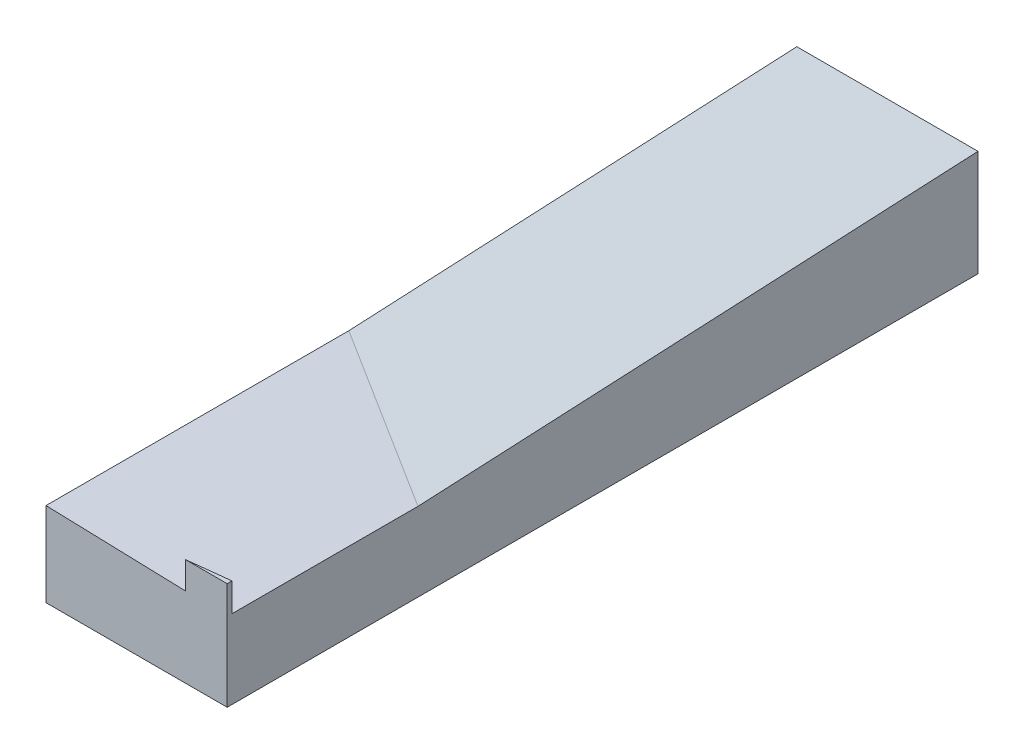
ISO-10303-21;
HEADER;
FILE_DESCRIPTION(('STEP AP214'),'2;1');
FILE_NAME('part.step','',(''),(''),'','','');
FILE_SCHEMA(('AUTOMOTIVE_DESIGN { 1 0 10303 214 1 1 1 1 }'));
ENDSEC;
DATA;
#1=APPLICATION_CONTEXT('core data for automotive mechanical design processes');
#2=APPLICATION_PROTOCOL_DEFINITION('international standard','automotive_design',2000,#1);
#3=PRODUCT_CONTEXT('',#1,'mechanical');
#4=PRODUCT('Part','Part','',(#3));
#5=PRODUCT_RELATED_PRODUCT_CATEGORY('part','',(#4));
#6=PRODUCT_DEFINITION_FORMATION('','',#4);
#7=PRODUCT_DEFINITION_CONTEXT('part definition',#1,'design');
#8=PRODUCT_DEFINITION('design','',#6,#7);
#9=PRODUCT_DEFINITION_SHAPE('','',#8);
#10=(LENGTH_UNIT() NAMED_UNIT(*) SI_UNIT(.MILLI.,.METRE.));
#11=(NAMED_UNIT(*) PLANE_ANGLE_UNIT() SI_UNIT($,.RADIAN.));
#12=(NAMED_UNIT(*) SI_UNIT($,.STERADIAN.) SOLID_ANGLE_UNIT());
#13=UNCERTAINTY_MEASURE_WITH_UNIT(LENGTH_MEASURE(1.E-05),#10,'distance_accuracy_value','');
#14=(GEOMETRIC_REPRESENTATION_CONTEXT(3) GLOBAL_UNCERTAINTY_ASSIGNED_CONTEXT((#13)) GLOBAL_UNIT_ASSIGNED_CONTEXT((#10,
#11,#12)) REPRESENTATION_CONTEXT('',''));
#15=CARTESIAN_POINT('',(0.,0.,0.));
#16=DIRECTION('',(0.,0.,1.));
#17=DIRECTION('',(1.,0.,0.));
#18=AXIS2_PLACEMENT_3D('',#15,#16,#17);
#19=CARTESIAN_POINT('',(285.75,0.,0.));
#20=DIRECTION('',(-1.,0.,0.));
#21=DIRECTION('',(0.,0.,1.));
#22=AXIS2_PLACEMENT_3D('',#19,#20,#21);
#23=PLANE('',#22);
#24=DIRECTION('',(0.,1.,0.));
#25=VECTOR('',#24,1.);
#26=CARTESIAN_POINT('',(285.75,0.,-584.2));
#27=LINE('',#26,#25);
#28=CARTESIAN_POINT('',(285.75,0.,-584.2));
#29=VERTEX_POINT('',#28);
#30=CARTESIAN_POINT('',(285.75,82.55,-584.2));
#31=VERTEX_POINT('',#30);
#32=EDGE_CURVE('E11',#29,#31,#27,.T.);
#33=ORIENTED_EDGE('',*,*,#32,.T.);
#34=DIRECTION('',(0.,-0.0489608186254638,0.998800699959469));
#35=VECTOR('',#34,1.);
#36=CARTESIAN_POINT('',(285.75,82.55,-584.2));
#37=LINE('',#36,#35);
#38=CARTESIAN_POINT('',(285.75,61.1909090909092,-148.474545454545));
#39=VERTEX_POINT('',#38);
#40=EDGE_CURVE('E66',#31,#39,#37,.T.);
#41=ORIENTED_EDGE('',*,*,#40,.T.);
#42=DIRECTION('',(0.,0.,1.));
#43=VECTOR('',#42,1.);
#44=CARTESIAN_POINT('',(285.75,61.1909090909092,-584.2));
#45=LINE('',#44,#43);
#46=CARTESIAN_POINT('',(285.75,61.1909090909092,-3.74645109826675));
#47=VERTEX_POINT('',#46);
#48=EDGE_CURVE('E160',#39,#47,#45,.T.);
#49=ORIENTED_EDGE('',*,*,#48,.T.);
#50=DIRECTION('',(0.,-1.,0.));
#51=VECTOR('',#50,1.);
#52=CARTESIAN_POINT('',(285.75,83.312,-3.74645109826675));
#53=LINE('',#52,#51);
#54=CARTESIAN_POINT('',(285.75,83.312,-3.74645109826675));
#55=VERTEX_POINT('',#54);
#56=EDGE_CURVE('E121',#55,#47,#53,.T.);
#57=ORIENTED_EDGE('',*,*,#56,.F.);
#58=DIRECTION('',(0.,0.,-1.));
#59=VECTOR('',#58,1.);
#60=CARTESIAN_POINT('',(285.75,83.312,0.));
#61=LINE('',#60,#59);
#62=CARTESIAN_POINT('',(285.75,83.312,0.));
#63=VERTEX_POINT('',#62);
#64=EDGE_CURVE('E145',#63,#55,#61,.T.);
#65=ORIENTED_EDGE('',*,*,#64,.F.);
#66=DIRECTION('',(0.,1.,0.));
#67=VECTOR('',#66,1.);
#68=CARTESIAN_POINT('',(285.75,0.,0.));
#69=LINE('',#68,#67);
#70=CARTESIAN_POINT('',(285.75,0.,0.));
#71=VERTEX_POINT('',#70);
#72=EDGE_CURVE('E152',#71,#63,#69,.T.);
#73=ORIENTED_EDGE('',*,*,#72,.F.);
#74=DIRECTION('',(0.,0.,-1.));
#75=VECTOR('',#74,1.);
#76=CARTESIAN_POINT('',(285.75,0.,-584.2));
#77=LINE('',#76,#75);
#78=EDGE_CURVE('E58',#71,#29,#77,.T.);
#79=ORIENTED_EDGE('',*,*,#78,.T.);
#80=EDGE_LOOP('',(#33,#41,#49,#57,#65,#73,#79));
#81=FACE_BOUND('',#80,.T.);
#82=ADVANCED_FACE('F42',(#81),#23,.F.);
#83=CARTESIAN_POINT('',(144.78,0.,0.));
#84=DIRECTION('',(-1.,0.,0.));
#85=DIRECTION('',(0.,0.,1.));
#86=AXIS2_PLACEMENT_3D('',#83,#84,#85);
#87=PLANE('',#86);
#88=DIRECTION('',(0.,0.,1.));
#89=VECTOR('',#88,1.);
#90=CARTESIAN_POINT('',(144.78,65.4627272727274,-584.2));
#91=LINE('',#90,#89);
#92=CARTESIAN_POINT('',(144.78,65.4627272727274,-235.619636363636));
#93=VERTEX_POINT('',#92);
#94=CARTESIAN_POINT('',(144.78,65.4627272727274,0.));
#95=VERTEX_POINT('',#94);
#96=EDGE_CURVE('E45',#93,#95,#91,.T.);
#97=ORIENTED_EDGE('',*,*,#96,.F.);
#98=DIRECTION('',(0.,-0.0489608186254638,0.998800699959469));
#99=VECTOR('',#98,1.);
#100=CARTESIAN_POINT('',(144.78,82.55,-584.2));
#101=LINE('',#100,#99);
#102=CARTESIAN_POINT('',(144.78,82.55,-584.2));
#103=VERTEX_POINT('',#102);
#104=EDGE_CURVE('E164',#103,#93,#101,.T.);
#105=ORIENTED_EDGE('',*,*,#104,.F.);
#106=DIRECTION('',(0.,1.,0.));
#107=VECTOR('',#106,1.);
#108=CARTESIAN_POINT('',(144.78,0.,-584.2));
#109=LINE('',#108,#107);
#110=CARTESIAN_POINT('',(144.78,0.,-584.2));
#111=VERTEX_POINT('',#110);
#112=EDGE_CURVE('E149',#111,#103,#109,.T.);
#113=ORIENTED_EDGE('',*,*,#112,.F.);
#114=DIRECTION('',(0.,0.,-1.));
#115=VECTOR('',#114,1.);
#116=CARTESIAN_POINT('',(144.78,0.,-584.2));
#117=LINE('',#116,#115);
#118=CARTESIAN_POINT('',(144.78,0.,0.));
#119=VERTEX_POINT('',#118);
#120=EDGE_CURVE('E157',#119,#111,#117,.T.);
#121=ORIENTED_EDGE('',*,*,#120,.F.);
#122=DIRECTION('',(0.,1.,0.));
#123=VECTOR('',#122,1.);
#124=CARTESIAN_POINT('',(144.78,0.,0.));
#125=LINE('',#124,#123);
#126=EDGE_CURVE('E51',#119,#95,#125,.T.);
#127=ORIENTED_EDGE('',*,*,#126,.T.);
#128=EDGE_LOOP('',(#97,#105,#113,#121,#127));
#129=FACE_BOUND('',#128,.T.);
#130=ADVANCED_FACE('F174',(#129),#87,.T.);
#131=CARTESIAN_POINT('',(-943.794471192522,82.55,-584.2));
#132=DIRECTION('',(0.,0.998800699959469,0.0489608186254638));
#133=DIRECTION('',(0.,-0.0489608186254638,0.998800699959469));
#134=AXIS2_PLACEMENT_3D('',#131,#132,#133);
#135=PLANE('',#134);
#136=DIRECTION('',(1.,0.,0.));
#137=VECTOR('',#136,1.);
#138=CARTESIAN_POINT('',(-943.794471192522,82.55,-584.2));
#139=LINE('',#138,#137);
#140=EDGE_CURVE('E125',#103,#31,#139,.T.);
#141=ORIENTED_EDGE('',*,*,#140,.F.);
#142=ORIENTED_EDGE('',*,*,#104,.T.);
#143=DIRECTION('',(0.850312150745116,-0.025767034871064,0.525647511369709));
#144=VECTOR('',#143,1.);
#145=CARTESIAN_POINT('',(-419.1,82.55,-584.2));
#146=LINE('',#145,#144);
#147=EDGE_CURVE('E131',#93,#39,#146,.T.);
#148=ORIENTED_EDGE('',*,*,#147,.T.);
#149=ORIENTED_EDGE('',*,*,#40,.F.);
#150=EDGE_LOOP('',(#141,#142,#148,#149));
#151=FACE_BOUND('',#150,.T.);
#152=ADVANCED_FACE('F198',(#151),#135,.T.);
#153=CARTESIAN_POINT('',(-419.1,0.,-584.2));
#154=DIRECTION('',(0.,-1.,0.));
#155=DIRECTION('',(0.,0.,-1.));
#156=AXIS2_PLACEMENT_3D('',#153,#154,#155);
#157=PLANE('',#156);
#158=DIRECTION('',(1.,0.,0.));
#159=VECTOR('',#158,1.);
#160=CARTESIAN_POINT('',(-419.1,0.,0.));
#161=LINE('',#160,#159);
#162=EDGE_CURVE('E132',#119,#71,#161,.T.);
#163=ORIENTED_EDGE('',*,*,#162,.F.);
#164=ORIENTED_EDGE('',*,*,#120,.T.);
#165=DIRECTION('',(1.,0.,0.));
#166=VECTOR('',#165,1.);
#167=CARTESIAN_POINT('',(-419.1,0.,-584.2));
#168=LINE('',#167,#166);
#169=EDGE_CURVE('E138',#111,#29,#168,.T.);
#170=ORIENTED_EDGE('',*,*,#169,.T.);
#171=ORIENTED_EDGE('',*,*,#78,.F.);
#172=EDGE_LOOP('',(#163,#164,#170,#171));
#173=FACE_BOUND('',#172,.T.);
#174=ADVANCED_FACE('F178',(#173),#157,.T.);
#175=CARTESIAN_POINT('',(0.,0.,-584.2));
#176=DIRECTION('',(0.,0.,-1.));
#177=DIRECTION('',(-1.,0.,0.));
#178=AXIS2_PLACEMENT_3D('',#175,#176,#177);
#179=PLANE('',#178);
#180=ORIENTED_EDGE('',*,*,#169,.F.);
#181=ORIENTED_EDGE('',*,*,#112,.T.);
#182=ORIENTED_EDGE('',*,*,#140,.T.);
#183=ORIENTED_EDGE('',*,*,#32,.F.);
#184=EDGE_LOOP('',(#180,#181,#182,#183));
#185=FACE_BOUND('',#184,.T.);
#186=ADVANCED_FACE('F218',(#185),#179,.T.);
#187=CARTESIAN_POINT('',(-419.1,82.55,-584.2));
#188=DIRECTION('',(0.0302891266407689,0.999541179145381,0.));
#189=DIRECTION('',(-0.999541179145382,0.030289126640769,0.));
#190=AXIS2_PLACEMENT_3D('',#187,#188,#189);
#191=PLANE('',#190);
#192=ORIENTED_EDGE('',*,*,#147,.F.);
#193=ORIENTED_EDGE('',*,*,#96,.T.);
#194=DIRECTION('',(-0.999541179145381,0.030289126640769,0.));
#195=VECTOR('',#194,1.);
#196=CARTESIAN_POINT('',(-419.1,82.55,0.));
#197=LINE('',#196,#195);
#198=CARTESIAN_POINT('',(253.272919891048,62.1750630336047,0.));
#199=VERTEX_POINT('',#198);
#200=EDGE_CURVE('E109',#199,#95,#197,.T.);
#201=ORIENTED_EDGE('',*,*,#200,.F.);
#202=DIRECTION('',(0.992962268681576,-0.0300897657176233,-0.114544921204726));
#203=VECTOR('',#202,1.);
#204=CARTESIAN_POINT('',(-343.831906804647,80.2691486910499,68.8800848552211));
#205=LINE('',#204,#203);
#206=EDGE_CURVE('E116',#199,#47,#205,.T.);
#207=ORIENTED_EDGE('',*,*,#206,.T.);
#208=ORIENTED_EDGE('',*,*,#48,.F.);
#209=EDGE_LOOP('',(#192,#193,#201,#207,#208));
#210=FACE_BOUND('',#209,.T.);
#211=ADVANCED_FACE('F128',(#210),#191,.T.);
#212=CARTESIAN_POINT('',(419.1,83.312,-19.1292765332465));
#213=DIRECTION('',(0.114596810584884,0.,0.993412085191122));
#214=DIRECTION('',(0.993412085191122,0.,-0.114596810584884));
#215=AXIS2_PLACEMENT_3D('',#212,#213,#214);
#216=PLANE('',#215);
#217=DIRECTION('',(-0.993412085191122,0.,0.114596810584884));
#218=VECTOR('',#217,1.);
#219=CARTESIAN_POINT('',(419.1,83.312,-19.1292765332465));
#220=LINE('',#219,#218);
#221=CARTESIAN_POINT('',(253.272919891048,83.312,0.));
#222=VERTEX_POINT('',#221);
#223=EDGE_CURVE('E148',#55,#222,#220,.T.);
#224=ORIENTED_EDGE('',*,*,#223,.F.);
#225=ORIENTED_EDGE('',*,*,#56,.T.);
#226=ORIENTED_EDGE('',*,*,#206,.F.);
#227=DIRECTION('',(0.,-1.,0.));
#228=VECTOR('',#227,1.);
#229=CARTESIAN_POINT('',(253.272919891048,83.312,0.));
#230=LINE('',#229,#228);
#231=EDGE_CURVE('E104',#222,#199,#230,.T.);
#232=ORIENTED_EDGE('',*,*,#231,.F.);
#233=EDGE_LOOP('',(#224,#225,#226,#232));
#234=FACE_BOUND('',#233,.T.);
#235=ADVANCED_FACE('F119',(#234),#216,.F.);
#236=CARTESIAN_POINT('',(0.,0.,0.));
#237=DIRECTION('',(0.,0.,-1.));
#238=DIRECTION('',(-1.,0.,0.));
#239=AXIS2_PLACEMENT_3D('',#236,#237,#238);
#240=PLANE('',#239);
#241=ORIENTED_EDGE('',*,*,#126,.F.);
#242=ORIENTED_EDGE('',*,*,#162,.T.);
#243=ORIENTED_EDGE('',*,*,#72,.T.);
#244=DIRECTION('',(1.,0.,0.));
#245=VECTOR('',#244,1.);
#246=CARTESIAN_POINT('',(253.272919891048,83.312,0.));
#247=LINE('',#246,#245);
#248=EDGE_CURVE('E112',#222,#63,#247,.T.);
#249=ORIENTED_EDGE('',*,*,#248,.F.);
#250=ORIENTED_EDGE('',*,*,#231,.T.);
#251=ORIENTED_EDGE('',*,*,#200,.T.);
#252=EDGE_LOOP('',(#241,#242,#243,#249,#250,#251));
#253=FACE_BOUND('',#252,.T.);
#254=ADVANCED_FACE('F107',(#253),#240,.F.);
#255=CARTESIAN_POINT('',(0.,83.312,0.));
#256=DIRECTION('',(0.,-1.,0.));
#257=DIRECTION('',(0.,0.,-1.));
#258=AXIS2_PLACEMENT_3D('',#255,#256,#257);
#259=PLANE('',#258);
#260=ORIENTED_EDGE('',*,*,#248,.T.);
#261=ORIENTED_EDGE('',*,*,#64,.T.);
#262=ORIENTED_EDGE('',*,*,#223,.T.);
#263=EDGE_LOOP('',(#260,#261,#262));
#264=FACE_BOUND('',#263,.T.);
#265=ADVANCED_FACE('F182',(#264),#259,.F.);
#266=CLOSED_SHELL('',(#82,#130,#152,#174,#186,#211,#235,#254,#265));
#267=MANIFOLD_SOLID_BREP('B2',#266);
#268=ADVANCED_BREP_SHAPE_REPRESENTATION('',(#18,#267),#14);
#269=SHAPE_DEFINITION_REPRESENTATION(#9,#268);
ENDSEC;
END-ISO-10303-21;
